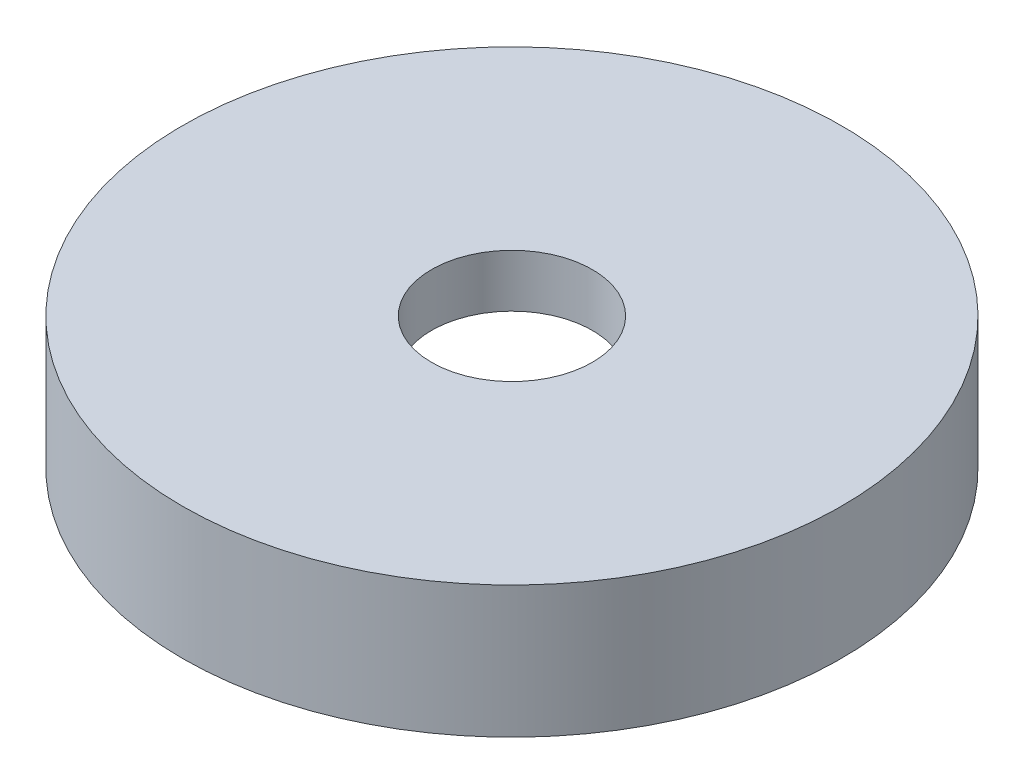
ISO-10303-21;
HEADER;
FILE_DESCRIPTION(('STEP AP214'),'2;1');
FILE_NAME('part.step','',(''),(''),'','','');
FILE_SCHEMA(('AUTOMOTIVE_DESIGN { 1 0 10303 214 1 1 1 1 }'));
ENDSEC;
DATA;
#1=APPLICATION_CONTEXT('core data for automotive mechanical design processes');
#2=APPLICATION_PROTOCOL_DEFINITION('international standard','automotive_design',2000,#1);
#3=PRODUCT_CONTEXT('',#1,'mechanical');
#4=PRODUCT('Part','Part','',(#3));
#5=PRODUCT_RELATED_PRODUCT_CATEGORY('part','',(#4));
#6=PRODUCT_DEFINITION_FORMATION('','',#4);
#7=PRODUCT_DEFINITION_CONTEXT('part definition',#1,'design');
#8=PRODUCT_DEFINITION('design','',#6,#7);
#9=PRODUCT_DEFINITION_SHAPE('','',#8);
#10=(LENGTH_UNIT() NAMED_UNIT(*) SI_UNIT(.MILLI.,.METRE.));
#11=(NAMED_UNIT(*) PLANE_ANGLE_UNIT() SI_UNIT($,.RADIAN.));
#12=(NAMED_UNIT(*) SI_UNIT($,.STERADIAN.) SOLID_ANGLE_UNIT());
#13=UNCERTAINTY_MEASURE_WITH_UNIT(LENGTH_MEASURE(1.E-05),#10,'distance_accuracy_value','');
#14=(GEOMETRIC_REPRESENTATION_CONTEXT(3) GLOBAL_UNCERTAINTY_ASSIGNED_CONTEXT((#13)) GLOBAL_UNIT_ASSIGNED_CONTEXT((#10,
#11,#12)) REPRESENTATION_CONTEXT('',''));
#15=CARTESIAN_POINT('',(0.,0.,0.));
#16=DIRECTION('',(0.,0.,1.));
#17=DIRECTION('',(1.,0.,0.));
#18=AXIS2_PLACEMENT_3D('',#15,#16,#17);
#19=CARTESIAN_POINT('',(0.,0.,0.));
#20=DIRECTION('',(0.,1.,0.));
#21=DIRECTION('',(0.,0.,1.));
#22=AXIS2_PLACEMENT_3D('',#19,#20,#21);
#23=PLANE('',#22);
#24=CARTESIAN_POINT('',(0.,0.,0.));
#25=DIRECTION('',(0.,1.,0.));
#26=DIRECTION('',(0.,0.,1.));
#27=AXIS2_PLACEMENT_3D('',#24,#25,#26);
#28=CIRCLE('',#27,12.5);
#29=CARTESIAN_POINT('',(0.,0.,12.5));
#30=VERTEX_POINT('',#29);
#31=EDGE_CURVE('E11',#30,#30,#28,.T.);
#32=ORIENTED_EDGE('',*,*,#31,.F.);
#33=EDGE_LOOP('',(#32));
#34=FACE_BOUND('',#33,.T.);
#35=DIRECTION('',(0.5,0.,-0.866025403784439));
#36=VECTOR('',#35,1.);
#37=CARTESIAN_POINT('',(4.96521231503078,0.,8.6));
#38=LINE('',#37,#36);
#39=CARTESIAN_POINT('',(4.96521231503078,0.,8.6));
#40=VERTEX_POINT('',#39);
#41=CARTESIAN_POINT('',(9.93042463006156,0.,0.));
#42=VERTEX_POINT('',#41);
#43=EDGE_CURVE('E48',#40,#42,#38,.T.);
#44=ORIENTED_EDGE('',*,*,#43,.T.);
#45=DIRECTION('',(-0.5,0.,-0.866025403784439));
#46=VECTOR('',#45,1.);
#47=CARTESIAN_POINT('',(9.93042463006156,0.,0.));
#48=LINE('',#47,#46);
#49=CARTESIAN_POINT('',(4.96521231503078,0.,-8.6));
#50=VERTEX_POINT('',#49);
#51=EDGE_CURVE('E104',#42,#50,#48,.T.);
#52=ORIENTED_EDGE('',*,*,#51,.T.);
#53=DIRECTION('',(-1.,0.,0.));
#54=VECTOR('',#53,1.);
#55=CARTESIAN_POINT('',(4.96521231503078,0.,-8.6));
#56=LINE('',#55,#54);
#57=CARTESIAN_POINT('',(-4.96521231503078,0.,-8.60000000000001));
#58=VERTEX_POINT('',#57);
#59=EDGE_CURVE('E102',#50,#58,#56,.T.);
#60=ORIENTED_EDGE('',*,*,#59,.T.);
#61=DIRECTION('',(-0.5,0.,0.866025403784439));
#62=VECTOR('',#61,1.);
#63=CARTESIAN_POINT('',(-4.96521231503078,0.,-8.60000000000001));
#64=LINE('',#63,#62);
#65=CARTESIAN_POINT('',(-9.93042463006157,0.,0.));
#66=VERTEX_POINT('',#65);
#67=EDGE_CURVE('E83',#58,#66,#64,.T.);
#68=ORIENTED_EDGE('',*,*,#67,.T.);
#69=DIRECTION('',(0.5,0.,0.866025403784439));
#70=VECTOR('',#69,1.);
#71=CARTESIAN_POINT('',(-9.93042463006157,0.,0.));
#72=LINE('',#71,#70);
#73=CARTESIAN_POINT('',(-4.96521231503079,0.,8.6));
#74=VERTEX_POINT('',#73);
#75=EDGE_CURVE('E92',#66,#74,#72,.T.);
#76=ORIENTED_EDGE('',*,*,#75,.T.);
#77=DIRECTION('',(1.,0.,0.));
#78=VECTOR('',#77,1.);
#79=CARTESIAN_POINT('',(-4.96521231503079,0.,8.6));
#80=LINE('',#79,#78);
#81=EDGE_CURVE('E98',#74,#40,#80,.T.);
#82=ORIENTED_EDGE('',*,*,#81,.T.);
#83=EDGE_LOOP('',(#44,#52,#60,#68,#76,#82));
#84=FACE_BOUND('',#83,.T.);
#85=ADVANCED_FACE('F33',(#34,#84),#23,.F.);
#86=CARTESIAN_POINT('',(0.,3.,0.));
#87=DIRECTION('',(0.,-1.,0.));
#88=DIRECTION('',(0.,0.,-1.));
#89=AXIS2_PLACEMENT_3D('',#86,#87,#88);
#90=CYLINDRICAL_SURFACE('',#89,12.5);
#91=ORIENTED_EDGE('',*,*,#31,.T.);
#92=EDGE_LOOP('',(#91));
#93=FACE_BOUND('',#92,.T.);
#94=CARTESIAN_POINT('',(0.,5.,0.));
#95=DIRECTION('',(0.,1.,0.));
#96=DIRECTION('',(0.,0.,1.));
#97=AXIS2_PLACEMENT_3D('',#94,#95,#96);
#98=CIRCLE('',#97,12.5);
#99=CARTESIAN_POINT('',(0.,5.,12.5));
#100=VERTEX_POINT('',#99);
#101=EDGE_CURVE('E122',#100,#100,#98,.T.);
#102=ORIENTED_EDGE('',*,*,#101,.F.);
#103=EDGE_LOOP('',(#102));
#104=FACE_BOUND('',#103,.T.);
#105=ADVANCED_FACE('F35',(#93,#104),#90,.T.);
#106=CARTESIAN_POINT('',(4.96521231503078,3.,8.6));
#107=DIRECTION('',(-0.866025403784439,0.,-0.5));
#108=DIRECTION('',(-0.5,0.,0.866025403784439));
#109=AXIS2_PLACEMENT_3D('',#106,#107,#108);
#110=PLANE('',#109);
#111=ORIENTED_EDGE('',*,*,#43,.F.);
#112=DIRECTION('',(0.,-1.,0.));
#113=VECTOR('',#112,1.);
#114=CARTESIAN_POINT('',(4.96521231503078,3.,8.6));
#115=LINE('',#114,#113);
#116=CARTESIAN_POINT('',(4.96521231503078,3.,8.6));
#117=VERTEX_POINT('',#116);
#118=EDGE_CURVE('E110',#117,#40,#115,.T.);
#119=ORIENTED_EDGE('',*,*,#118,.F.);
#120=DIRECTION('',(0.5,0.,-0.866025403784439));
#121=VECTOR('',#120,1.);
#122=CARTESIAN_POINT('',(4.96521231503078,3.,8.6));
#123=LINE('',#122,#121);
#124=CARTESIAN_POINT('',(9.93042463006156,3.,0.));
#125=VERTEX_POINT('',#124);
#126=EDGE_CURVE('E109',#117,#125,#123,.T.);
#127=ORIENTED_EDGE('',*,*,#126,.T.);
#128=DIRECTION('',(0.,-1.,0.));
#129=VECTOR('',#128,1.);
#130=CARTESIAN_POINT('',(9.93042463006156,3.,0.));
#131=LINE('',#130,#129);
#132=EDGE_CURVE('E41',#125,#42,#131,.T.);
#133=ORIENTED_EDGE('',*,*,#132,.T.);
#134=EDGE_LOOP('',(#111,#119,#127,#133));
#135=FACE_BOUND('',#134,.T.);
#136=ADVANCED_FACE('F118',(#135),#110,.T.);
#137=CARTESIAN_POINT('',(9.93042463006156,3.,0.));
#138=DIRECTION('',(-0.866025403784439,0.,0.5));
#139=DIRECTION('',(0.5,0.,0.866025403784439));
#140=AXIS2_PLACEMENT_3D('',#137,#138,#139);
#141=PLANE('',#140);
#142=ORIENTED_EDGE('',*,*,#51,.F.);
#143=ORIENTED_EDGE('',*,*,#132,.F.);
#144=DIRECTION('',(-0.5,0.,-0.866025403784439));
#145=VECTOR('',#144,1.);
#146=CARTESIAN_POINT('',(9.93042463006156,3.,0.));
#147=LINE('',#146,#145);
#148=CARTESIAN_POINT('',(4.96521231503078,3.,-8.6));
#149=VERTEX_POINT('',#148);
#150=EDGE_CURVE('E135',#125,#149,#147,.T.);
#151=ORIENTED_EDGE('',*,*,#150,.T.);
#152=DIRECTION('',(0.,-1.,0.));
#153=VECTOR('',#152,1.);
#154=CARTESIAN_POINT('',(4.96521231503078,3.,-8.6));
#155=LINE('',#154,#153);
#156=EDGE_CURVE('E115',#149,#50,#155,.T.);
#157=ORIENTED_EDGE('',*,*,#156,.T.);
#158=EDGE_LOOP('',(#142,#143,#151,#157));
#159=FACE_BOUND('',#158,.T.);
#160=ADVANCED_FACE('F171',(#159),#141,.T.);
#161=CARTESIAN_POINT('',(4.96521231503078,3.,-8.6));
#162=DIRECTION('',(0.,0.,1.));
#163=DIRECTION('',(1.,0.,0.));
#164=AXIS2_PLACEMENT_3D('',#161,#162,#163);
#165=PLANE('',#164);
#166=ORIENTED_EDGE('',*,*,#59,.F.);
#167=ORIENTED_EDGE('',*,*,#156,.F.);
#168=DIRECTION('',(-1.,0.,0.));
#169=VECTOR('',#168,1.);
#170=CARTESIAN_POINT('',(4.96521231503078,3.,-8.6));
#171=LINE('',#170,#169);
#172=CARTESIAN_POINT('',(-4.96521231503078,3.,-8.60000000000001));
#173=VERTEX_POINT('',#172);
#174=EDGE_CURVE('E133',#149,#173,#171,.T.);
#175=ORIENTED_EDGE('',*,*,#174,.T.);
#176=DIRECTION('',(0.,-1.,0.));
#177=VECTOR('',#176,1.);
#178=CARTESIAN_POINT('',(-4.96521231503078,3.,-8.60000000000001));
#179=LINE('',#178,#177);
#180=EDGE_CURVE('E88',#173,#58,#179,.T.);
#181=ORIENTED_EDGE('',*,*,#180,.T.);
#182=EDGE_LOOP('',(#166,#167,#175,#181));
#183=FACE_BOUND('',#182,.T.);
#184=ADVANCED_FACE('F174',(#183),#165,.T.);
#185=CARTESIAN_POINT('',(-4.96521231503078,3.,-8.60000000000001));
#186=DIRECTION('',(0.866025403784439,0.,0.5));
#187=DIRECTION('',(0.5,0.,-0.866025403784439));
#188=AXIS2_PLACEMENT_3D('',#185,#186,#187);
#189=PLANE('',#188);
#190=ORIENTED_EDGE('',*,*,#67,.F.);
#191=ORIENTED_EDGE('',*,*,#180,.F.);
#192=DIRECTION('',(-0.5,0.,0.866025403784439));
#193=VECTOR('',#192,1.);
#194=CARTESIAN_POINT('',(-4.96521231503078,3.,-8.60000000000001));
#195=LINE('',#194,#193);
#196=CARTESIAN_POINT('',(-9.93042463006157,3.,0.));
#197=VERTEX_POINT('',#196);
#198=EDGE_CURVE('E57',#173,#197,#195,.T.);
#199=ORIENTED_EDGE('',*,*,#198,.T.);
#200=DIRECTION('',(0.,-1.,0.));
#201=VECTOR('',#200,1.);
#202=CARTESIAN_POINT('',(-9.93042463006157,3.,0.));
#203=LINE('',#202,#201);
#204=EDGE_CURVE('E78',#197,#66,#203,.T.);
#205=ORIENTED_EDGE('',*,*,#204,.T.);
#206=EDGE_LOOP('',(#190,#191,#199,#205));
#207=FACE_BOUND('',#206,.T.);
#208=ADVANCED_FACE('F80',(#207),#189,.T.);
#209=CARTESIAN_POINT('',(-9.93042463006157,3.,0.));
#210=DIRECTION('',(0.866025403784439,0.,-0.5));
#211=DIRECTION('',(-0.5,0.,-0.866025403784439));
#212=AXIS2_PLACEMENT_3D('',#209,#210,#211);
#213=PLANE('',#212);
#214=ORIENTED_EDGE('',*,*,#75,.F.);
#215=ORIENTED_EDGE('',*,*,#204,.F.);
#216=DIRECTION('',(0.5,0.,0.866025403784439));
#217=VECTOR('',#216,1.);
#218=CARTESIAN_POINT('',(-9.93042463006157,3.,0.));
#219=LINE('',#218,#217);
#220=CARTESIAN_POINT('',(-4.96521231503079,3.,8.6));
#221=VERTEX_POINT('',#220);
#222=EDGE_CURVE('E130',#197,#221,#219,.T.);
#223=ORIENTED_EDGE('',*,*,#222,.T.);
#224=DIRECTION('',(0.,-1.,0.));
#225=VECTOR('',#224,1.);
#226=CARTESIAN_POINT('',(-4.96521231503079,3.,8.6));
#227=LINE('',#226,#225);
#228=EDGE_CURVE('E89',#221,#74,#227,.T.);
#229=ORIENTED_EDGE('',*,*,#228,.T.);
#230=EDGE_LOOP('',(#214,#215,#223,#229));
#231=FACE_BOUND('',#230,.T.);
#232=ADVANCED_FACE('F93',(#231),#213,.T.);
#233=CARTESIAN_POINT('',(-4.96521231503079,3.,8.6));
#234=DIRECTION('',(0.,0.,-1.));
#235=DIRECTION('',(-1.,0.,0.));
#236=AXIS2_PLACEMENT_3D('',#233,#234,#235);
#237=PLANE('',#236);
#238=ORIENTED_EDGE('',*,*,#81,.F.);
#239=ORIENTED_EDGE('',*,*,#228,.F.);
#240=DIRECTION('',(1.,0.,0.));
#241=VECTOR('',#240,1.);
#242=CARTESIAN_POINT('',(-4.96521231503079,3.,8.6));
#243=LINE('',#242,#241);
#244=EDGE_CURVE('E112',#221,#117,#243,.T.);
#245=ORIENTED_EDGE('',*,*,#244,.T.);
#246=ORIENTED_EDGE('',*,*,#118,.T.);
#247=EDGE_LOOP('',(#238,#239,#245,#246));
#248=FACE_BOUND('',#247,.T.);
#249=ADVANCED_FACE('F150',(#248),#237,.T.);
#250=CARTESIAN_POINT('',(0.,5.,0.));
#251=DIRECTION('',(0.,1.,0.));
#252=DIRECTION('',(0.,0.,1.));
#253=AXIS2_PLACEMENT_3D('',#250,#251,#252);
#254=PLANE('',#253);
#255=ORIENTED_EDGE('',*,*,#101,.T.);
#256=EDGE_LOOP('',(#255));
#257=FACE_BOUND('',#256,.T.);
#258=CARTESIAN_POINT('',(0.,5.,0.));
#259=DIRECTION('',(0.,1.,0.));
#260=DIRECTION('',(0.,0.,1.));
#261=AXIS2_PLACEMENT_3D('',#258,#259,#260);
#262=CIRCLE('',#261,3.05);
#263=CARTESIAN_POINT('',(0.,5.,3.05));
#264=VERTEX_POINT('',#263);
#265=EDGE_CURVE('E125',#264,#264,#262,.T.);
#266=ORIENTED_EDGE('',*,*,#265,.F.);
#267=EDGE_LOOP('',(#266));
#268=FACE_BOUND('',#267,.T.);
#269=ADVANCED_FACE('F147',(#257,#268),#254,.T.);
#270=CARTESIAN_POINT('',(0.,3.,0.));
#271=DIRECTION('',(0.,1.,0.));
#272=DIRECTION('',(0.,0.,1.));
#273=AXIS2_PLACEMENT_3D('',#270,#271,#272);
#274=PLANE('',#273);
#275=ORIENTED_EDGE('',*,*,#150,.F.);
#276=ORIENTED_EDGE('',*,*,#126,.F.);
#277=ORIENTED_EDGE('',*,*,#244,.F.);
#278=ORIENTED_EDGE('',*,*,#222,.F.);
#279=ORIENTED_EDGE('',*,*,#198,.F.);
#280=ORIENTED_EDGE('',*,*,#174,.F.);
#281=EDGE_LOOP('',(#275,#276,#277,#278,#279,#280));
#282=FACE_BOUND('',#281,.T.);
#283=CARTESIAN_POINT('',(0.,3.,0.));
#284=DIRECTION('',(0.,1.,0.));
#285=DIRECTION('',(0.,0.,1.));
#286=AXIS2_PLACEMENT_3D('',#283,#284,#285);
#287=CIRCLE('',#286,3.05);
#288=CARTESIAN_POINT('',(0.,3.,3.05));
#289=VERTEX_POINT('',#288);
#290=EDGE_CURVE('E138',#289,#289,#287,.T.);
#291=ORIENTED_EDGE('',*,*,#290,.T.);
#292=EDGE_LOOP('',(#291));
#293=FACE_BOUND('',#292,.T.);
#294=ADVANCED_FACE('F149',(#282,#293),#274,.F.);
#295=CARTESIAN_POINT('',(0.,5.,0.));
#296=DIRECTION('',(0.,-1.,0.));
#297=DIRECTION('',(0.,0.,-1.));
#298=AXIS2_PLACEMENT_3D('',#295,#296,#297);
#299=CYLINDRICAL_SURFACE('',#298,3.05);
#300=ORIENTED_EDGE('',*,*,#265,.T.);
#301=EDGE_LOOP('',(#300));
#302=FACE_BOUND('',#301,.T.);
#303=ORIENTED_EDGE('',*,*,#290,.F.);
#304=EDGE_LOOP('',(#303));
#305=FACE_BOUND('',#304,.T.);
#306=ADVANCED_FACE('F144',(#302,#305),#299,.F.);
#307=CLOSED_SHELL('',(#85,#105,#136,#160,#184,#208,#232,#249,#269,#294,#306));
#308=MANIFOLD_SOLID_BREP('B2',#307);
#309=ADVANCED_BREP_SHAPE_REPRESENTATION('',(#18,#308),#14);
#310=SHAPE_DEFINITION_REPRESENTATION(#9,#309);
ENDSEC;
END-ISO-10303-21;
